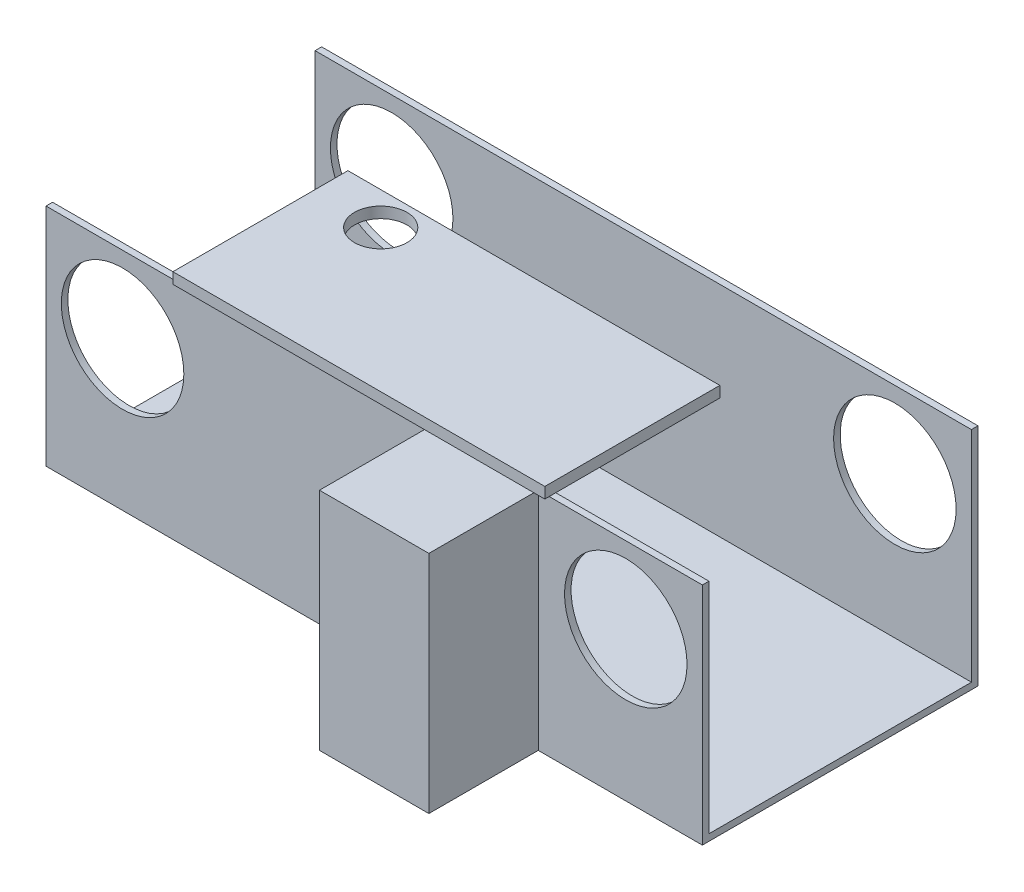
ISO-10303-21;
HEADER;
FILE_DESCRIPTION(('STEP AP214'),'2;1');
FILE_NAME('part.step','',(''),(''),'','','');
FILE_SCHEMA(('AUTOMOTIVE_DESIGN { 1 0 10303 214 1 1 1 1 }'));
ENDSEC;
DATA;
#1=APPLICATION_CONTEXT('core data for automotive mechanical design processes');
#2=APPLICATION_PROTOCOL_DEFINITION('international standard','automotive_design',2000,#1);
#3=PRODUCT_CONTEXT('',#1,'mechanical');
#4=PRODUCT('Part','Part','',(#3));
#5=PRODUCT_RELATED_PRODUCT_CATEGORY('part','',(#4));
#6=PRODUCT_DEFINITION_FORMATION('','',#4);
#7=PRODUCT_DEFINITION_CONTEXT('part definition',#1,'design');
#8=PRODUCT_DEFINITION('design','',#6,#7);
#9=PRODUCT_DEFINITION_SHAPE('','',#8);
#10=(LENGTH_UNIT() NAMED_UNIT(*) SI_UNIT(.MILLI.,.METRE.));
#11=(NAMED_UNIT(*) PLANE_ANGLE_UNIT() SI_UNIT($,.RADIAN.));
#12=(NAMED_UNIT(*) SI_UNIT($,.STERADIAN.) SOLID_ANGLE_UNIT());
#13=UNCERTAINTY_MEASURE_WITH_UNIT(LENGTH_MEASURE(1.E-05),#10,'distance_accuracy_value','');
#14=(GEOMETRIC_REPRESENTATION_CONTEXT(3) GLOBAL_UNCERTAINTY_ASSIGNED_CONTEXT((#13)) GLOBAL_UNIT_ASSIGNED_CONTEXT((#10,
#11,#12)) REPRESENTATION_CONTEXT('',''));
#15=CARTESIAN_POINT('',(0.,0.,0.));
#16=DIRECTION('',(0.,0.,1.));
#17=DIRECTION('',(1.,0.,0.));
#18=AXIS2_PLACEMENT_3D('',#15,#16,#17);
#19=CARTESIAN_POINT('',(0.,103.,0.));
#20=DIRECTION('',(0.,1.,0.));
#21=DIRECTION('',(0.,0.,1.));
#22=AXIS2_PLACEMENT_3D('',#19,#20,#21);
#23=PLANE('',#22);
#24=DIRECTION('',(0.,0.,-1.));
#25=VECTOR('',#24,1.);
#26=CARTESIAN_POINT('',(83.935860058309,103.,-3.65597667638484));
#27=LINE('',#26,#25);
#28=CARTESIAN_POINT('',(83.935860058309,103.,74.3440233236152));
#29=VERTEX_POINT('',#28);
#30=CARTESIAN_POINT('',(83.935860058309,103.,71.3440233236152));
#31=VERTEX_POINT('',#30);
#32=EDGE_CURVE('E11',#29,#31,#27,.T.);
#33=ORIENTED_EDGE('',*,*,#32,.F.);
#34=DIRECTION('',(1.,0.,0.));
#35=VECTOR('',#34,1.);
#36=CARTESIAN_POINT('',(-146.064139941691,103.,74.3440233236152));
#37=LINE('',#36,#35);
#38=CARTESIAN_POINT('',(153.935860058309,103.,74.3440233236152));
#39=VERTEX_POINT('',#38);
#40=EDGE_CURVE('E256',#29,#39,#37,.T.);
#41=ORIENTED_EDGE('',*,*,#40,.T.);
#42=DIRECTION('',(0.,0.,-1.));
#43=VECTOR('',#42,1.);
#44=CARTESIAN_POINT('',(153.935860058309,103.,71.3440233236152));
#45=LINE('',#44,#43);
#46=CARTESIAN_POINT('',(153.935860058309,103.,71.3440233236152));
#47=VERTEX_POINT('',#46);
#48=EDGE_CURVE('E265',#39,#47,#45,.T.);
#49=ORIENTED_EDGE('',*,*,#48,.T.);
#50=DIRECTION('',(-1.,0.,0.));
#51=VECTOR('',#50,1.);
#52=CARTESIAN_POINT('',(-146.064139941691,103.,71.3440233236152));
#53=LINE('',#52,#51);
#54=EDGE_CURVE('E270',#47,#31,#53,.T.);
#55=ORIENTED_EDGE('',*,*,#54,.T.);
#56=EDGE_LOOP('',(#33,#41,#49,#55));
#57=FACE_BOUND('',#56,.T.);
#58=ADVANCED_FACE('F39',(#57),#23,.T.);
#59=DIRECTION('',(1.,0.,0.));
#60=VECTOR('',#59,1.);
#61=CARTESIAN_POINT('',(-86.0641399416909,103.,76.3440233236152));
#62=LINE('',#61,#60);
#63=CARTESIAN_POINT('',(28.9358600583091,103.,76.3440233236152));
#64=VERTEX_POINT('',#63);
#65=CARTESIAN_POINT('',(78.935860058309,103.,76.3440233236152));
#66=VERTEX_POINT('',#65);
#67=EDGE_CURVE('E48',#64,#66,#62,.T.);
#68=ORIENTED_EDGE('',*,*,#67,.F.);
#69=DIRECTION('',(0.,0.,-1.));
#70=VECTOR('',#69,1.);
#71=CARTESIAN_POINT('',(28.9358600583091,103.,124.344023323615));
#72=LINE('',#71,#70);
#73=CARTESIAN_POINT('',(28.9358600583091,103.,124.344023323615));
#74=VERTEX_POINT('',#73);
#75=EDGE_CURVE('E225',#74,#64,#72,.T.);
#76=ORIENTED_EDGE('',*,*,#75,.F.);
#77=DIRECTION('',(-1.,0.,0.));
#78=VECTOR('',#77,1.);
#79=CARTESIAN_POINT('',(78.935860058309,103.,124.344023323615));
#80=LINE('',#79,#78);
#81=CARTESIAN_POINT('',(78.935860058309,103.,124.344023323615));
#82=VERTEX_POINT('',#81);
#83=EDGE_CURVE('E220',#82,#74,#80,.T.);
#84=ORIENTED_EDGE('',*,*,#83,.F.);
#85=DIRECTION('',(0.,0.,-1.));
#86=VECTOR('',#85,1.);
#87=CARTESIAN_POINT('',(78.935860058309,103.,124.344023323615));
#88=LINE('',#87,#86);
#89=EDGE_CURVE('E228',#82,#66,#88,.T.);
#90=ORIENTED_EDGE('',*,*,#89,.T.);
#91=EDGE_LOOP('',(#68,#76,#84,#90));
#92=FACE_BOUND('',#91,.T.);
#93=ADVANCED_FACE('F345',(#92),#23,.T.);
#94=CARTESIAN_POINT('',(-146.064139941691,3.,74.3440233236152));
#95=DIRECTION('',(0.,0.,-1.));
#96=DIRECTION('',(-1.,0.,0.));
#97=AXIS2_PLACEMENT_3D('',#94,#95,#96);
#98=PLANE('',#97);
#99=CARTESIAN_POINT('',(-111.064139941691,68.,74.3440233236152));
#100=DIRECTION('',(0.,0.,1.));
#101=DIRECTION('',(1.,0.,0.));
#102=AXIS2_PLACEMENT_3D('',#99,#100,#101);
#103=CIRCLE('',#102,28.);
#104=CARTESIAN_POINT('',(-83.0641399416909,68.,74.3440233236152));
#105=VERTEX_POINT('',#104);
#106=EDGE_CURVE('E237',#105,#105,#103,.T.);
#107=ORIENTED_EDGE('',*,*,#106,.F.);
#108=EDGE_LOOP('',(#107));
#109=FACE_BOUND('',#108,.T.);
#110=DIRECTION('',(0.,-1.,0.));
#111=VECTOR('',#110,1.);
#112=CARTESIAN_POINT('',(28.9358600583091,0.,74.3440233236152));
#113=LINE('',#112,#111);
#114=CARTESIAN_POINT('',(28.9358600583091,103.,74.3440233236152));
#115=VERTEX_POINT('',#114);
#116=CARTESIAN_POINT('',(28.9358600583091,0.,74.3440233236152));
#117=VERTEX_POINT('',#116);
#118=EDGE_CURVE('E203',#115,#117,#113,.T.);
#119=ORIENTED_EDGE('',*,*,#118,.F.);
#120=CARTESIAN_POINT('',(-86.0641399416909,103.,74.3440233236152));
#121=VERTEX_POINT('',#120);
#122=EDGE_CURVE('E263',#121,#115,#37,.T.);
#123=ORIENTED_EDGE('',*,*,#122,.F.);
#124=CARTESIAN_POINT('',(-146.064139941691,103.,74.3440233236152));
#125=VERTEX_POINT('',#124);
#126=EDGE_CURVE('E257',#125,#121,#37,.T.);
#127=ORIENTED_EDGE('',*,*,#126,.F.);
#128=DIRECTION('',(0.,-1.,0.));
#129=VECTOR('',#128,1.);
#130=CARTESIAN_POINT('',(-146.064139941691,3.,74.3440233236152));
#131=LINE('',#130,#129);
#132=CARTESIAN_POINT('',(-146.064139941691,0.,74.3440233236152));
#133=VERTEX_POINT('',#132);
#134=EDGE_CURVE('E317',#125,#133,#131,.T.);
#135=ORIENTED_EDGE('',*,*,#134,.T.);
#136=DIRECTION('',(1.,0.,0.));
#137=VECTOR('',#136,1.);
#138=CARTESIAN_POINT('',(-146.064139941691,0.,74.3440233236152));
#139=LINE('',#138,#137);
#140=EDGE_CURVE('E308',#133,#117,#139,.T.);
#141=ORIENTED_EDGE('',*,*,#140,.T.);
#142=EDGE_LOOP('',(#119,#123,#127,#135,#141));
#143=FACE_BOUND('',#142,.T.);
#144=ADVANCED_FACE('F353',(#109,#143),#98,.F.);
#145=CARTESIAN_POINT('',(118.935860058309,68.,74.3440233236152));
#146=DIRECTION('',(0.,0.,1.));
#147=DIRECTION('',(-1.,0.,0.));
#148=AXIS2_PLACEMENT_3D('',#145,#146,#147);
#149=CIRCLE('',#148,28.);
#150=CARTESIAN_POINT('',(90.9358600583091,68.,74.3440233236152));
#151=VERTEX_POINT('',#150);
#152=EDGE_CURVE('E231',#151,#151,#149,.T.);
#153=ORIENTED_EDGE('',*,*,#152,.F.);
#154=EDGE_LOOP('',(#153));
#155=FACE_BOUND('',#154,.T.);
#156=DIRECTION('',(0.,1.,0.));
#157=VECTOR('',#156,1.);
#158=CARTESIAN_POINT('',(78.935860058309,0.,74.3440233236152));
#159=LINE('',#158,#157);
#160=CARTESIAN_POINT('',(78.935860058309,0.,74.3440233236152));
#161=VERTEX_POINT('',#160);
#162=CARTESIAN_POINT('',(78.935860058309,103.,74.3440233236152));
#163=VERTEX_POINT('',#162);
#164=EDGE_CURVE('E204',#161,#163,#159,.T.);
#165=ORIENTED_EDGE('',*,*,#164,.F.);
#166=CARTESIAN_POINT('',(153.935860058309,0.,74.3440233236152));
#167=VERTEX_POINT('',#166);
#168=EDGE_CURVE('E301',#161,#167,#139,.T.);
#169=ORIENTED_EDGE('',*,*,#168,.T.);
#170=DIRECTION('',(0.,-1.,0.));
#171=VECTOR('',#170,1.);
#172=CARTESIAN_POINT('',(153.935860058309,3.,74.3440233236152));
#173=LINE('',#172,#171);
#174=EDGE_CURVE('E316',#39,#167,#173,.T.);
#175=ORIENTED_EDGE('',*,*,#174,.F.);
#176=ORIENTED_EDGE('',*,*,#40,.F.);
#177=EDGE_CURVE('E262',#163,#29,#37,.T.);
#178=ORIENTED_EDGE('',*,*,#177,.F.);
#179=EDGE_LOOP('',(#165,#169,#175,#176,#178));
#180=FACE_BOUND('',#179,.T.);
#181=ADVANCED_FACE('F379',(#155,#180),#98,.F.);
#182=CARTESIAN_POINT('',(-146.064139941691,3.,-51.6559766763848));
#183=DIRECTION('',(1.,0.,0.));
#184=DIRECTION('',(0.,0.,-1.));
#185=AXIS2_PLACEMENT_3D('',#182,#183,#184);
#186=PLANE('',#185);
#187=DIRECTION('',(0.,0.,1.));
#188=VECTOR('',#187,1.);
#189=CARTESIAN_POINT('',(-146.064139941691,0.,-51.6559766763848));
#190=LINE('',#189,#188);
#191=CARTESIAN_POINT('',(-146.064139941691,0.,-51.6559766763848));
#192=VERTEX_POINT('',#191);
#193=EDGE_CURVE('E279',#192,#133,#190,.T.);
#194=ORIENTED_EDGE('',*,*,#193,.T.);
#195=ORIENTED_EDGE('',*,*,#134,.F.);
#196=DIRECTION('',(0.,0.,1.));
#197=VECTOR('',#196,1.);
#198=CARTESIAN_POINT('',(-146.064139941691,103.,71.3440233236152));
#199=LINE('',#198,#197);
#200=CARTESIAN_POINT('',(-146.064139941691,103.,71.3440233236152));
#201=VERTEX_POINT('',#200);
#202=EDGE_CURVE('E254',#201,#125,#199,.T.);
#203=ORIENTED_EDGE('',*,*,#202,.F.);
#204=DIRECTION('',(0.,-1.,0.));
#205=VECTOR('',#204,1.);
#206=CARTESIAN_POINT('',(-146.064139941691,103.,71.3440233236152));
#207=LINE('',#206,#205);
#208=CARTESIAN_POINT('',(-146.064139941691,3.,71.3440233236152));
#209=VERTEX_POINT('',#208);
#210=EDGE_CURVE('E267',#201,#209,#207,.T.);
#211=ORIENTED_EDGE('',*,*,#210,.T.);
#212=DIRECTION('',(0.,0.,1.));
#213=VECTOR('',#212,1.);
#214=CARTESIAN_POINT('',(-146.064139941691,3.,-51.6559766763848));
#215=LINE('',#214,#213);
#216=CARTESIAN_POINT('',(-146.064139941691,3.,-48.6559766763848));
#217=VERTEX_POINT('',#216);
#218=EDGE_CURVE('E300',#217,#209,#215,.T.);
#219=ORIENTED_EDGE('',*,*,#218,.F.);
#220=DIRECTION('',(0.,-1.,0.));
#221=VECTOR('',#220,1.);
#222=CARTESIAN_POINT('',(-146.064139941691,103.,-48.6559766763848));
#223=LINE('',#222,#221);
#224=CARTESIAN_POINT('',(-146.064139941691,103.,-48.6559766763848));
#225=VERTEX_POINT('',#224);
#226=EDGE_CURVE('E255',#225,#217,#223,.T.);
#227=ORIENTED_EDGE('',*,*,#226,.F.);
#228=DIRECTION('',(0.,0.,1.));
#229=VECTOR('',#228,1.);
#230=CARTESIAN_POINT('',(-146.064139941691,103.,-51.6559766763848));
#231=LINE('',#230,#229);
#232=CARTESIAN_POINT('',(-146.064139941691,103.,-51.6559766763848));
#233=VERTEX_POINT('',#232);
#234=EDGE_CURVE('E290',#233,#225,#231,.T.);
#235=ORIENTED_EDGE('',*,*,#234,.F.);
#236=DIRECTION('',(0.,-1.,0.));
#237=VECTOR('',#236,1.);
#238=CARTESIAN_POINT('',(-146.064139941691,3.,-51.6559766763848));
#239=LINE('',#238,#237);
#240=EDGE_CURVE('E305',#233,#192,#239,.T.);
#241=ORIENTED_EDGE('',*,*,#240,.T.);
#242=EDGE_LOOP('',(#194,#195,#203,#211,#219,#227,#235,#241));
#243=FACE_BOUND('',#242,.T.);
#244=ADVANCED_FACE('F41',(#243),#186,.F.);
#245=CARTESIAN_POINT('',(153.935860058309,3.,-51.6559766763848));
#246=DIRECTION('',(-1.,0.,0.));
#247=DIRECTION('',(0.,0.,1.));
#248=AXIS2_PLACEMENT_3D('',#245,#246,#247);
#249=PLANE('',#248);
#250=DIRECTION('',(0.,0.,-1.));
#251=VECTOR('',#250,1.);
#252=CARTESIAN_POINT('',(153.935860058309,0.,-51.6559766763848));
#253=LINE('',#252,#251);
#254=CARTESIAN_POINT('',(153.935860058309,0.,-51.6559766763848));
#255=VERTEX_POINT('',#254);
#256=EDGE_CURVE('E306',#167,#255,#253,.T.);
#257=ORIENTED_EDGE('',*,*,#256,.T.);
#258=DIRECTION('',(0.,-1.,0.));
#259=VECTOR('',#258,1.);
#260=CARTESIAN_POINT('',(153.935860058309,3.,-51.6559766763848));
#261=LINE('',#260,#259);
#262=CARTESIAN_POINT('',(153.935860058309,103.,-51.6559766763848));
#263=VERTEX_POINT('',#262);
#264=EDGE_CURVE('E311',#263,#255,#261,.T.);
#265=ORIENTED_EDGE('',*,*,#264,.F.);
#266=DIRECTION('',(0.,0.,-1.));
#267=VECTOR('',#266,1.);
#268=CARTESIAN_POINT('',(153.935860058309,103.,-51.6559766763848));
#269=LINE('',#268,#267);
#270=CARTESIAN_POINT('',(153.935860058309,103.,-48.6559766763848));
#271=VERTEX_POINT('',#270);
#272=EDGE_CURVE('E286',#271,#263,#269,.T.);
#273=ORIENTED_EDGE('',*,*,#272,.F.);
#274=DIRECTION('',(0.,-1.,0.));
#275=VECTOR('',#274,1.);
#276=CARTESIAN_POINT('',(153.935860058309,103.,-48.6559766763848));
#277=LINE('',#276,#275);
#278=CARTESIAN_POINT('',(153.935860058309,3.,-48.6559766763848));
#279=VERTEX_POINT('',#278);
#280=EDGE_CURVE('E283',#271,#279,#277,.T.);
#281=ORIENTED_EDGE('',*,*,#280,.T.);
#282=DIRECTION('',(0.,0.,-1.));
#283=VECTOR('',#282,1.);
#284=CARTESIAN_POINT('',(153.935860058309,3.,-51.6559766763848));
#285=LINE('',#284,#283);
#286=CARTESIAN_POINT('',(153.935860058309,3.,71.3440233236152));
#287=VERTEX_POINT('',#286);
#288=EDGE_CURVE('E299',#287,#279,#285,.T.);
#289=ORIENTED_EDGE('',*,*,#288,.F.);
#290=DIRECTION('',(0.,-1.,0.));
#291=VECTOR('',#290,1.);
#292=CARTESIAN_POINT('',(153.935860058309,103.,71.3440233236152));
#293=LINE('',#292,#291);
#294=EDGE_CURVE('E274',#47,#287,#293,.T.);
#295=ORIENTED_EDGE('',*,*,#294,.F.);
#296=ORIENTED_EDGE('',*,*,#48,.F.);
#297=ORIENTED_EDGE('',*,*,#174,.T.);
#298=EDGE_LOOP('',(#257,#265,#273,#281,#289,#295,#296,#297));
#299=FACE_BOUND('',#298,.T.);
#300=ADVANCED_FACE('F374',(#299),#249,.F.);
#301=CARTESIAN_POINT('',(-146.064139941691,3.,-51.6559766763848));
#302=DIRECTION('',(0.,0.,1.));
#303=DIRECTION('',(1.,0.,0.));
#304=AXIS2_PLACEMENT_3D('',#301,#302,#303);
#305=PLANE('',#304);
#306=CARTESIAN_POINT('',(-111.064139941691,68.,-51.6559766763848));
#307=DIRECTION('',(0.,0.,1.));
#308=DIRECTION('',(1.,0.,0.));
#309=AXIS2_PLACEMENT_3D('',#306,#307,#308);
#310=CIRCLE('',#309,28.);
#311=CARTESIAN_POINT('',(-83.0641399416909,68.,-51.6559766763848));
#312=VERTEX_POINT('',#311);
#313=EDGE_CURVE('E253',#312,#312,#310,.T.);
#314=ORIENTED_EDGE('',*,*,#313,.T.);
#315=EDGE_LOOP('',(#314));
#316=FACE_BOUND('',#315,.T.);
#317=CARTESIAN_POINT('',(118.935860058309,68.,-51.6559766763848));
#318=DIRECTION('',(0.,0.,1.));
#319=DIRECTION('',(1.,0.,0.));
#320=AXIS2_PLACEMENT_3D('',#317,#318,#319);
#321=CIRCLE('',#320,28.);
#322=CARTESIAN_POINT('',(146.935860058309,68.,-51.6559766763848));
#323=VERTEX_POINT('',#322);
#324=EDGE_CURVE('E242',#323,#323,#321,.T.);
#325=ORIENTED_EDGE('',*,*,#324,.T.);
#326=EDGE_LOOP('',(#325));
#327=FACE_BOUND('',#326,.T.);
#328=DIRECTION('',(-1.,0.,0.));
#329=VECTOR('',#328,1.);
#330=CARTESIAN_POINT('',(-146.064139941691,0.,-51.6559766763848));
#331=LINE('',#330,#329);
#332=EDGE_CURVE('E297',#255,#192,#331,.T.);
#333=ORIENTED_EDGE('',*,*,#332,.T.);
#334=ORIENTED_EDGE('',*,*,#240,.F.);
#335=DIRECTION('',(-1.,0.,0.));
#336=VECTOR('',#335,1.);
#337=CARTESIAN_POINT('',(-146.064139941691,103.,-51.6559766763848));
#338=LINE('',#337,#336);
#339=EDGE_CURVE('E284',#263,#233,#338,.T.);
#340=ORIENTED_EDGE('',*,*,#339,.F.);
#341=ORIENTED_EDGE('',*,*,#264,.T.);
#342=EDGE_LOOP('',(#333,#334,#340,#341));
#343=FACE_BOUND('',#342,.T.);
#344=ADVANCED_FACE('F366',(#316,#327,#343),#305,.F.);
#345=CARTESIAN_POINT('',(0.,3.,0.));
#346=DIRECTION('',(0.,1.,0.));
#347=DIRECTION('',(0.,0.,1.));
#348=AXIS2_PLACEMENT_3D('',#345,#346,#347);
#349=PLANE('',#348);
#350=DIRECTION('',(-1.,0.,0.));
#351=VECTOR('',#350,1.);
#352=CARTESIAN_POINT('',(-146.064139941691,3.,71.3440233236152));
#353=LINE('',#352,#351);
#354=EDGE_CURVE('E259',#287,#209,#353,.T.);
#355=ORIENTED_EDGE('',*,*,#354,.F.);
#356=ORIENTED_EDGE('',*,*,#288,.T.);
#357=DIRECTION('',(1.,0.,0.));
#358=VECTOR('',#357,1.);
#359=CARTESIAN_POINT('',(-146.064139941691,3.,-48.6559766763848));
#360=LINE('',#359,#358);
#361=EDGE_CURVE('E275',#217,#279,#360,.T.);
#362=ORIENTED_EDGE('',*,*,#361,.F.);
#363=ORIENTED_EDGE('',*,*,#218,.T.);
#364=EDGE_LOOP('',(#355,#356,#362,#363));
#365=FACE_BOUND('',#364,.T.);
#366=ADVANCED_FACE('F364',(#365),#349,.T.);
#367=CARTESIAN_POINT('',(0.,0.,0.));
#368=DIRECTION('',(0.,1.,0.));
#369=DIRECTION('',(0.,0.,1.));
#370=AXIS2_PLACEMENT_3D('',#367,#368,#369);
#371=PLANE('',#370);
#372=ORIENTED_EDGE('',*,*,#193,.F.);
#373=ORIENTED_EDGE('',*,*,#332,.F.);
#374=ORIENTED_EDGE('',*,*,#256,.F.);
#375=ORIENTED_EDGE('',*,*,#168,.F.);
#376=DIRECTION('',(0.,0.,-1.));
#377=VECTOR('',#376,1.);
#378=CARTESIAN_POINT('',(78.935860058309,0.,124.344023323615));
#379=LINE('',#378,#377);
#380=CARTESIAN_POINT('',(78.935860058309,0.,124.344023323615));
#381=VERTEX_POINT('',#380);
#382=EDGE_CURVE('E229',#381,#161,#379,.T.);
#383=ORIENTED_EDGE('',*,*,#382,.F.);
#384=DIRECTION('',(1.,0.,0.));
#385=VECTOR('',#384,1.);
#386=CARTESIAN_POINT('',(78.935860058309,0.,124.344023323615));
#387=LINE('',#386,#385);
#388=CARTESIAN_POINT('',(28.9358600583091,0.,124.344023323615));
#389=VERTEX_POINT('',#388);
#390=EDGE_CURVE('E213',#389,#381,#387,.T.);
#391=ORIENTED_EDGE('',*,*,#390,.F.);
#392=DIRECTION('',(0.,0.,-1.));
#393=VECTOR('',#392,1.);
#394=CARTESIAN_POINT('',(28.9358600583091,0.,124.344023323615));
#395=LINE('',#394,#393);
#396=EDGE_CURVE('E235',#389,#117,#395,.T.);
#397=ORIENTED_EDGE('',*,*,#396,.T.);
#398=ORIENTED_EDGE('',*,*,#140,.F.);
#399=EDGE_LOOP('',(#372,#373,#374,#375,#383,#391,#397,#398));
#400=FACE_BOUND('',#399,.T.);
#401=ADVANCED_FACE('F356',(#400),#371,.F.);
#402=CARTESIAN_POINT('',(-146.064139941691,103.,-48.6559766763848));
#403=DIRECTION('',(0.,0.,-1.));
#404=DIRECTION('',(-1.,0.,0.));
#405=AXIS2_PLACEMENT_3D('',#402,#403,#404);
#406=PLANE('',#405);
#407=CARTESIAN_POINT('',(-111.064139941691,68.,-48.6559766763848));
#408=DIRECTION('',(0.,0.,-1.));
#409=DIRECTION('',(-1.,0.,0.));
#410=AXIS2_PLACEMENT_3D('',#407,#408,#409);
#411=CIRCLE('',#410,28.);
#412=CARTESIAN_POINT('',(-139.064139941691,68.,-48.6559766763848));
#413=VERTEX_POINT('',#412);
#414=EDGE_CURVE('E248',#413,#413,#411,.T.);
#415=ORIENTED_EDGE('',*,*,#414,.T.);
#416=EDGE_LOOP('',(#415));
#417=FACE_BOUND('',#416,.T.);
#418=CARTESIAN_POINT('',(118.935860058309,68.,-48.6559766763848));
#419=DIRECTION('',(0.,0.,-1.));
#420=DIRECTION('',(-1.,0.,0.));
#421=AXIS2_PLACEMENT_3D('',#418,#419,#420);
#422=CIRCLE('',#421,28.);
#423=CARTESIAN_POINT('',(90.9358600583091,68.,-48.6559766763848));
#424=VERTEX_POINT('',#423);
#425=EDGE_CURVE('E245',#424,#424,#422,.T.);
#426=ORIENTED_EDGE('',*,*,#425,.T.);
#427=EDGE_LOOP('',(#426));
#428=FACE_BOUND('',#427,.T.);
#429=ORIENTED_EDGE('',*,*,#361,.T.);
#430=ORIENTED_EDGE('',*,*,#280,.F.);
#431=DIRECTION('',(1.,0.,0.));
#432=VECTOR('',#431,1.);
#433=CARTESIAN_POINT('',(-146.064139941691,103.,-48.6559766763848));
#434=LINE('',#433,#432);
#435=EDGE_CURVE('E291',#225,#271,#434,.T.);
#436=ORIENTED_EDGE('',*,*,#435,.F.);
#437=ORIENTED_EDGE('',*,*,#226,.T.);
#438=EDGE_LOOP('',(#429,#430,#436,#437));
#439=FACE_BOUND('',#438,.T.);
#440=ADVANCED_FACE('F358',(#417,#428,#439),#406,.F.);
#441=CARTESIAN_POINT('',(0.,103.,0.));
#442=DIRECTION('',(0.,1.,0.));
#443=DIRECTION('',(0.,0.,1.));
#444=AXIS2_PLACEMENT_3D('',#441,#442,#443);
#445=PLANE('',#444);
#446=ORIENTED_EDGE('',*,*,#234,.T.);
#447=ORIENTED_EDGE('',*,*,#435,.T.);
#448=ORIENTED_EDGE('',*,*,#272,.T.);
#449=ORIENTED_EDGE('',*,*,#339,.T.);
#450=EDGE_LOOP('',(#446,#447,#448,#449));
#451=FACE_BOUND('',#450,.T.);
#452=ADVANCED_FACE('F357',(#451),#445,.T.);
#453=CARTESIAN_POINT('',(-146.064139941691,103.,71.3440233236152));
#454=DIRECTION('',(0.,0.,1.));
#455=DIRECTION('',(1.,0.,0.));
#456=AXIS2_PLACEMENT_3D('',#453,#454,#455);
#457=PLANE('',#456);
#458=CARTESIAN_POINT('',(-111.064139941691,68.,71.3440233236152));
#459=DIRECTION('',(0.,0.,1.));
#460=DIRECTION('',(1.,0.,0.));
#461=AXIS2_PLACEMENT_3D('',#458,#459,#460);
#462=CIRCLE('',#461,28.);
#463=CARTESIAN_POINT('',(-83.0641399416909,68.,71.3440233236152));
#464=VERTEX_POINT('',#463);
#465=EDGE_CURVE('E43',#464,#464,#462,.T.);
#466=ORIENTED_EDGE('',*,*,#465,.T.);
#467=EDGE_LOOP('',(#466));
#468=FACE_BOUND('',#467,.T.);
#469=CARTESIAN_POINT('',(118.935860058309,68.,71.3440233236152));
#470=DIRECTION('',(0.,0.,1.));
#471=DIRECTION('',(1.,0.,0.));
#472=AXIS2_PLACEMENT_3D('',#469,#470,#471);
#473=CIRCLE('',#472,28.);
#474=CARTESIAN_POINT('',(146.935860058309,68.,71.3440233236152));
#475=VERTEX_POINT('',#474);
#476=EDGE_CURVE('E239',#475,#475,#473,.T.);
#477=ORIENTED_EDGE('',*,*,#476,.T.);
#478=EDGE_LOOP('',(#477));
#479=FACE_BOUND('',#478,.T.);
#480=ORIENTED_EDGE('',*,*,#354,.T.);
#481=ORIENTED_EDGE('',*,*,#210,.F.);
#482=CARTESIAN_POINT('',(-86.0641399416909,103.,71.3440233236152));
#483=VERTEX_POINT('',#482);
#484=EDGE_CURVE('E266',#483,#201,#53,.T.);
#485=ORIENTED_EDGE('',*,*,#484,.F.);
#486=EDGE_CURVE('E62',#31,#483,#53,.T.);
#487=ORIENTED_EDGE('',*,*,#486,.F.);
#488=ORIENTED_EDGE('',*,*,#54,.F.);
#489=ORIENTED_EDGE('',*,*,#294,.T.);
#490=EDGE_LOOP('',(#480,#481,#485,#487,#488,#489));
#491=FACE_BOUND('',#490,.T.);
#492=ADVANCED_FACE('F322',(#468,#479,#491),#457,.F.);
#493=DIRECTION('',(0.,0.,1.));
#494=VECTOR('',#493,1.);
#495=CARTESIAN_POINT('',(-86.064139941691,103.,-3.65597667638484));
#496=LINE('',#495,#494);
#497=EDGE_CURVE('E59',#483,#121,#496,.T.);
#498=ORIENTED_EDGE('',*,*,#497,.F.);
#499=ORIENTED_EDGE('',*,*,#484,.T.);
#500=ORIENTED_EDGE('',*,*,#202,.T.);
#501=ORIENTED_EDGE('',*,*,#126,.T.);
#502=EDGE_LOOP('',(#498,#499,#500,#501));
#503=FACE_BOUND('',#502,.T.);
#504=ADVANCED_FACE('F328',(#503),#23,.T.);
#505=CARTESIAN_POINT('',(118.935860058309,68.,-111.655976676385));
#506=DIRECTION('',(0.,0.,1.));
#507=DIRECTION('',(1.,0.,0.));
#508=AXIS2_PLACEMENT_3D('',#505,#506,#507);
#509=CYLINDRICAL_SURFACE('',#508,28.);
#510=ORIENTED_EDGE('',*,*,#152,.T.);
#511=EDGE_LOOP('',(#510));
#512=FACE_BOUND('',#511,.T.);
#513=ORIENTED_EDGE('',*,*,#476,.F.);
#514=EDGE_LOOP('',(#513));
#515=FACE_BOUND('',#514,.T.);
#516=ADVANCED_FACE('F326',(#512,#515),#509,.F.);
#517=CARTESIAN_POINT('',(-111.064139941691,68.,-111.655976676385));
#518=DIRECTION('',(0.,0.,1.));
#519=DIRECTION('',(1.,0.,0.));
#520=AXIS2_PLACEMENT_3D('',#517,#518,#519);
#521=CYLINDRICAL_SURFACE('',#520,28.);
#522=ORIENTED_EDGE('',*,*,#106,.T.);
#523=EDGE_LOOP('',(#522));
#524=FACE_BOUND('',#523,.T.);
#525=ORIENTED_EDGE('',*,*,#465,.F.);
#526=EDGE_LOOP('',(#525));
#527=FACE_BOUND('',#526,.T.);
#528=ADVANCED_FACE('F327',(#524,#527),#521,.F.);
#529=ORIENTED_EDGE('',*,*,#425,.F.);
#530=EDGE_LOOP('',(#529));
#531=FACE_BOUND('',#530,.T.);
#532=ORIENTED_EDGE('',*,*,#324,.F.);
#533=EDGE_LOOP('',(#532));
#534=FACE_BOUND('',#533,.T.);
#535=ADVANCED_FACE('F335',(#531,#534),#509,.F.);
#536=ORIENTED_EDGE('',*,*,#414,.F.);
#537=EDGE_LOOP('',(#536));
#538=FACE_BOUND('',#537,.T.);
#539=ORIENTED_EDGE('',*,*,#313,.F.);
#540=EDGE_LOOP('',(#539));
#541=FACE_BOUND('',#540,.T.);
#542=ADVANCED_FACE('F339',(#538,#541),#521,.F.);
#543=CARTESIAN_POINT('',(28.9358600583091,0.,124.344023323615));
#544=DIRECTION('',(1.,0.,0.));
#545=DIRECTION('',(0.,0.,-1.));
#546=AXIS2_PLACEMENT_3D('',#543,#544,#545);
#547=PLANE('',#546);
#548=ORIENTED_EDGE('',*,*,#118,.T.);
#549=ORIENTED_EDGE('',*,*,#396,.F.);
#550=DIRECTION('',(0.,-1.,0.));
#551=VECTOR('',#550,1.);
#552=CARTESIAN_POINT('',(28.9358600583091,0.,124.344023323615));
#553=LINE('',#552,#551);
#554=EDGE_CURVE('E209',#74,#389,#553,.T.);
#555=ORIENTED_EDGE('',*,*,#554,.F.);
#556=ORIENTED_EDGE('',*,*,#75,.T.);
#557=EDGE_CURVE('E217',#64,#115,#72,.T.);
#558=ORIENTED_EDGE('',*,*,#557,.T.);
#559=EDGE_LOOP('',(#548,#549,#555,#556,#558));
#560=FACE_BOUND('',#559,.T.);
#561=ADVANCED_FACE('F458',(#560),#547,.F.);
#562=CARTESIAN_POINT('',(78.935860058309,0.,124.344023323615));
#563=DIRECTION('',(-1.,0.,0.));
#564=DIRECTION('',(0.,0.,1.));
#565=AXIS2_PLACEMENT_3D('',#562,#563,#564);
#566=PLANE('',#565);
#567=ORIENTED_EDGE('',*,*,#164,.T.);
#568=EDGE_CURVE('E223',#66,#163,#88,.T.);
#569=ORIENTED_EDGE('',*,*,#568,.F.);
#570=ORIENTED_EDGE('',*,*,#89,.F.);
#571=DIRECTION('',(0.,1.,0.));
#572=VECTOR('',#571,1.);
#573=CARTESIAN_POINT('',(78.935860058309,0.,124.344023323615));
#574=LINE('',#573,#572);
#575=EDGE_CURVE('E214',#381,#82,#574,.T.);
#576=ORIENTED_EDGE('',*,*,#575,.F.);
#577=ORIENTED_EDGE('',*,*,#382,.T.);
#578=EDGE_LOOP('',(#567,#569,#570,#576,#577));
#579=FACE_BOUND('',#578,.T.);
#580=ADVANCED_FACE('F438',(#579),#566,.F.);
#581=CARTESIAN_POINT('',(0.,0.,124.344023323615));
#582=DIRECTION('',(0.,0.,1.));
#583=DIRECTION('',(1.,0.,0.));
#584=AXIS2_PLACEMENT_3D('',#581,#582,#583);
#585=PLANE('',#584);
#586=ORIENTED_EDGE('',*,*,#554,.T.);
#587=ORIENTED_EDGE('',*,*,#390,.T.);
#588=ORIENTED_EDGE('',*,*,#575,.T.);
#589=ORIENTED_EDGE('',*,*,#83,.T.);
#590=EDGE_LOOP('',(#586,#587,#588,#589));
#591=FACE_BOUND('',#590,.T.);
#592=ADVANCED_FACE('F443',(#591),#585,.T.);
#593=CARTESIAN_POINT('',(0.,103.,0.));
#594=DIRECTION('',(0.,1.,0.));
#595=DIRECTION('',(0.,0.,1.));
#596=AXIS2_PLACEMENT_3D('',#593,#594,#595);
#597=PLANE('',#596);
#598=CARTESIAN_POINT('',(-86.0641399416909,103.,76.3440233236152));
#599=VERTEX_POINT('',#598);
#600=EDGE_CURVE('E396',#121,#599,#496,.T.);
#601=ORIENTED_EDGE('',*,*,#600,.F.);
#602=ORIENTED_EDGE('',*,*,#122,.T.);
#603=ORIENTED_EDGE('',*,*,#557,.F.);
#604=EDGE_CURVE('E191',#599,#64,#62,.T.);
#605=ORIENTED_EDGE('',*,*,#604,.F.);
#606=EDGE_LOOP('',(#601,#602,#603,#605));
#607=FACE_BOUND('',#606,.T.);
#608=ADVANCED_FACE('F400',(#607),#597,.F.);
#609=CARTESIAN_POINT('',(83.9358600583091,103.,76.3440233236152));
#610=VERTEX_POINT('',#609);
#611=EDGE_CURVE('E426',#66,#610,#62,.T.);
#612=ORIENTED_EDGE('',*,*,#611,.F.);
#613=ORIENTED_EDGE('',*,*,#568,.T.);
#614=ORIENTED_EDGE('',*,*,#177,.T.);
#615=EDGE_CURVE('E49',#610,#29,#27,.T.);
#616=ORIENTED_EDGE('',*,*,#615,.F.);
#617=EDGE_LOOP('',(#612,#613,#614,#616));
#618=FACE_BOUND('',#617,.T.);
#619=ADVANCED_FACE('F436',(#618),#597,.F.);
#620=CARTESIAN_POINT('',(-56.064139941691,103.,11.3440233236152));
#621=DIRECTION('',(0.,1.,0.));
#622=DIRECTION('',(0.,0.,1.));
#623=AXIS2_PLACEMENT_3D('',#620,#621,#622);
#624=CIRCLE('',#623,12.);
#625=CARTESIAN_POINT('',(-56.064139941691,103.,23.3440233236152));
#626=VERTEX_POINT('',#625);
#627=EDGE_CURVE('E492',#626,#626,#624,.T.);
#628=ORIENTED_EDGE('',*,*,#627,.T.);
#629=EDGE_LOOP('',(#628));
#630=FACE_BOUND('',#629,.T.);
#631=CARTESIAN_POINT('',(83.935860058309,103.,-3.65597667638484));
#632=VERTEX_POINT('',#631);
#633=EDGE_CURVE('E51',#31,#632,#27,.T.);
#634=ORIENTED_EDGE('',*,*,#633,.F.);
#635=ORIENTED_EDGE('',*,*,#486,.T.);
#636=CARTESIAN_POINT('',(-86.064139941691,103.,-3.65597667638484));
#637=VERTEX_POINT('',#636);
#638=EDGE_CURVE('E424',#637,#483,#496,.T.);
#639=ORIENTED_EDGE('',*,*,#638,.F.);
#640=DIRECTION('',(-1.,0.,0.));
#641=VECTOR('',#640,1.);
#642=CARTESIAN_POINT('',(-86.064139941691,103.,-3.65597667638484));
#643=LINE('',#642,#641);
#644=EDGE_CURVE('E414',#632,#637,#643,.T.);
#645=ORIENTED_EDGE('',*,*,#644,.F.);
#646=EDGE_LOOP('',(#634,#635,#639,#645));
#647=FACE_BOUND('',#646,.T.);
#648=ADVANCED_FACE('F412',(#630,#647),#597,.F.);
#649=CARTESIAN_POINT('',(0.,108.,0.));
#650=DIRECTION('',(0.,1.,0.));
#651=DIRECTION('',(0.,0.,1.));
#652=AXIS2_PLACEMENT_3D('',#649,#650,#651);
#653=PLANE('',#652);
#654=DIRECTION('',(0.,0.,-1.));
#655=VECTOR('',#654,1.);
#656=CARTESIAN_POINT('',(83.935860058309,108.,-3.65597667638484));
#657=LINE('',#656,#655);
#658=CARTESIAN_POINT('',(83.9358600583091,108.,76.3440233236152));
#659=VERTEX_POINT('',#658);
#660=CARTESIAN_POINT('',(83.935860058309,108.,-3.65597667638484));
#661=VERTEX_POINT('',#660);
#662=EDGE_CURVE('E183',#659,#661,#657,.T.);
#663=ORIENTED_EDGE('',*,*,#662,.T.);
#664=DIRECTION('',(-1.,0.,0.));
#665=VECTOR('',#664,1.);
#666=CARTESIAN_POINT('',(-86.064139941691,108.,-3.65597667638484));
#667=LINE('',#666,#665);
#668=CARTESIAN_POINT('',(-86.064139941691,108.,-3.65597667638484));
#669=VERTEX_POINT('',#668);
#670=EDGE_CURVE('E172',#661,#669,#667,.T.);
#671=ORIENTED_EDGE('',*,*,#670,.T.);
#672=DIRECTION('',(0.,0.,1.));
#673=VECTOR('',#672,1.);
#674=CARTESIAN_POINT('',(-86.064139941691,108.,-3.65597667638484));
#675=LINE('',#674,#673);
#676=CARTESIAN_POINT('',(-86.0641399416909,108.,76.3440233236152));
#677=VERTEX_POINT('',#676);
#678=EDGE_CURVE('E184',#669,#677,#675,.T.);
#679=ORIENTED_EDGE('',*,*,#678,.T.);
#680=DIRECTION('',(1.,0.,0.));
#681=VECTOR('',#680,1.);
#682=CARTESIAN_POINT('',(-86.0641399416909,108.,76.3440233236152));
#683=LINE('',#682,#681);
#684=EDGE_CURVE('E192',#677,#659,#683,.T.);
#685=ORIENTED_EDGE('',*,*,#684,.T.);
#686=EDGE_LOOP('',(#663,#671,#679,#685));
#687=FACE_BOUND('',#686,.T.);
#688=CARTESIAN_POINT('',(-56.064139941691,108.,11.3440233236152));
#689=DIRECTION('',(0.,1.,0.));
#690=DIRECTION('',(0.,0.,1.));
#691=AXIS2_PLACEMENT_3D('',#688,#689,#690);
#692=CIRCLE('',#691,12.);
#693=CARTESIAN_POINT('',(-56.064139941691,108.,23.3440233236152));
#694=VERTEX_POINT('',#693);
#695=EDGE_CURVE('E411',#694,#694,#692,.T.);
#696=ORIENTED_EDGE('',*,*,#695,.F.);
#697=EDGE_LOOP('',(#696));
#698=FACE_BOUND('',#697,.T.);
#699=ADVANCED_FACE('F186',(#687,#698),#653,.T.);
#700=CARTESIAN_POINT('',(83.935860058309,108.,-3.65597667638484));
#701=DIRECTION('',(-1.,0.,0.));
#702=DIRECTION('',(0.,0.,1.));
#703=AXIS2_PLACEMENT_3D('',#700,#701,#702);
#704=PLANE('',#703);
#705=ORIENTED_EDGE('',*,*,#615,.T.);
#706=ORIENTED_EDGE('',*,*,#32,.T.);
#707=ORIENTED_EDGE('',*,*,#633,.T.);
#708=DIRECTION('',(0.,-1.,0.));
#709=VECTOR('',#708,1.);
#710=CARTESIAN_POINT('',(83.935860058309,108.,-3.65597667638484));
#711=LINE('',#710,#709);
#712=EDGE_CURVE('E179',#661,#632,#711,.T.);
#713=ORIENTED_EDGE('',*,*,#712,.F.);
#714=ORIENTED_EDGE('',*,*,#662,.F.);
#715=DIRECTION('',(0.,-1.,0.));
#716=VECTOR('',#715,1.);
#717=CARTESIAN_POINT('',(83.9358600583091,108.,76.3440233236152));
#718=LINE('',#717,#716);
#719=EDGE_CURVE('E417',#659,#610,#718,.T.);
#720=ORIENTED_EDGE('',*,*,#719,.T.);
#721=EDGE_LOOP('',(#705,#706,#707,#713,#714,#720));
#722=FACE_BOUND('',#721,.T.);
#723=ADVANCED_FACE('F196',(#722),#704,.F.);
#724=CARTESIAN_POINT('',(-86.064139941691,108.,-3.65597667638484));
#725=DIRECTION('',(0.,0.,1.));
#726=DIRECTION('',(1.,0.,0.));
#727=AXIS2_PLACEMENT_3D('',#724,#725,#726);
#728=PLANE('',#727);
#729=ORIENTED_EDGE('',*,*,#644,.T.);
#730=DIRECTION('',(0.,-1.,0.));
#731=VECTOR('',#730,1.);
#732=CARTESIAN_POINT('',(-86.064139941691,108.,-3.65597667638484));
#733=LINE('',#732,#731);
#734=EDGE_CURVE('E182',#669,#637,#733,.T.);
#735=ORIENTED_EDGE('',*,*,#734,.F.);
#736=ORIENTED_EDGE('',*,*,#670,.F.);
#737=ORIENTED_EDGE('',*,*,#712,.T.);
#738=EDGE_LOOP('',(#729,#735,#736,#737));
#739=FACE_BOUND('',#738,.T.);
#740=ADVANCED_FACE('F180',(#739),#728,.F.);
#741=CARTESIAN_POINT('',(-86.064139941691,108.,-3.65597667638484));
#742=DIRECTION('',(1.,0.,0.));
#743=DIRECTION('',(0.,0.,-1.));
#744=AXIS2_PLACEMENT_3D('',#741,#742,#743);
#745=PLANE('',#744);
#746=ORIENTED_EDGE('',*,*,#638,.T.);
#747=ORIENTED_EDGE('',*,*,#497,.T.);
#748=ORIENTED_EDGE('',*,*,#600,.T.);
#749=DIRECTION('',(0.,-1.,0.));
#750=VECTOR('',#749,1.);
#751=CARTESIAN_POINT('',(-86.0641399416909,108.,76.3440233236152));
#752=LINE('',#751,#750);
#753=EDGE_CURVE('E206',#677,#599,#752,.T.);
#754=ORIENTED_EDGE('',*,*,#753,.F.);
#755=ORIENTED_EDGE('',*,*,#678,.F.);
#756=ORIENTED_EDGE('',*,*,#734,.T.);
#757=EDGE_LOOP('',(#746,#747,#748,#754,#755,#756));
#758=FACE_BOUND('',#757,.T.);
#759=ADVANCED_FACE('F432',(#758),#745,.F.);
#760=CARTESIAN_POINT('',(-86.0641399416909,108.,76.3440233236152));
#761=DIRECTION('',(0.,0.,-1.));
#762=DIRECTION('',(-1.,0.,0.));
#763=AXIS2_PLACEMENT_3D('',#760,#761,#762);
#764=PLANE('',#763);
#765=ORIENTED_EDGE('',*,*,#604,.T.);
#766=ORIENTED_EDGE('',*,*,#67,.T.);
#767=ORIENTED_EDGE('',*,*,#611,.T.);
#768=ORIENTED_EDGE('',*,*,#719,.F.);
#769=ORIENTED_EDGE('',*,*,#684,.F.);
#770=ORIENTED_EDGE('',*,*,#753,.T.);
#771=EDGE_LOOP('',(#765,#766,#767,#768,#769,#770));
#772=FACE_BOUND('',#771,.T.);
#773=ADVANCED_FACE('F431',(#772),#764,.F.);
#774=CARTESIAN_POINT('',(-56.064139941691,108.,11.3440233236152));
#775=DIRECTION('',(0.,-1.,0.));
#776=DIRECTION('',(0.,0.,-1.));
#777=AXIS2_PLACEMENT_3D('',#774,#775,#776);
#778=CYLINDRICAL_SURFACE('',#777,12.);
#779=ORIENTED_EDGE('',*,*,#695,.T.);
#780=EDGE_LOOP('',(#779));
#781=FACE_BOUND('',#780,.T.);
#782=ORIENTED_EDGE('',*,*,#627,.F.);
#783=EDGE_LOOP('',(#782));
#784=FACE_BOUND('',#783,.T.);
#785=ADVANCED_FACE('F479',(#781,#784),#778,.F.);
#786=CLOSED_SHELL('',(#58,#93,#144,#181,#244,#300,#344,#366,#401,#440,#452,#492,#504,#516,#528,
#535,#542,#561,#580,#592,#608,#619,#648,#699,#723,#740,#759,#773,#785));
#787=MANIFOLD_SOLID_BREP('B2',#786);
#788=ADVANCED_BREP_SHAPE_REPRESENTATION('',(#18,#787),#14);
#789=SHAPE_DEFINITION_REPRESENTATION(#9,#788);
ENDSEC;
END-ISO-10303-21;
